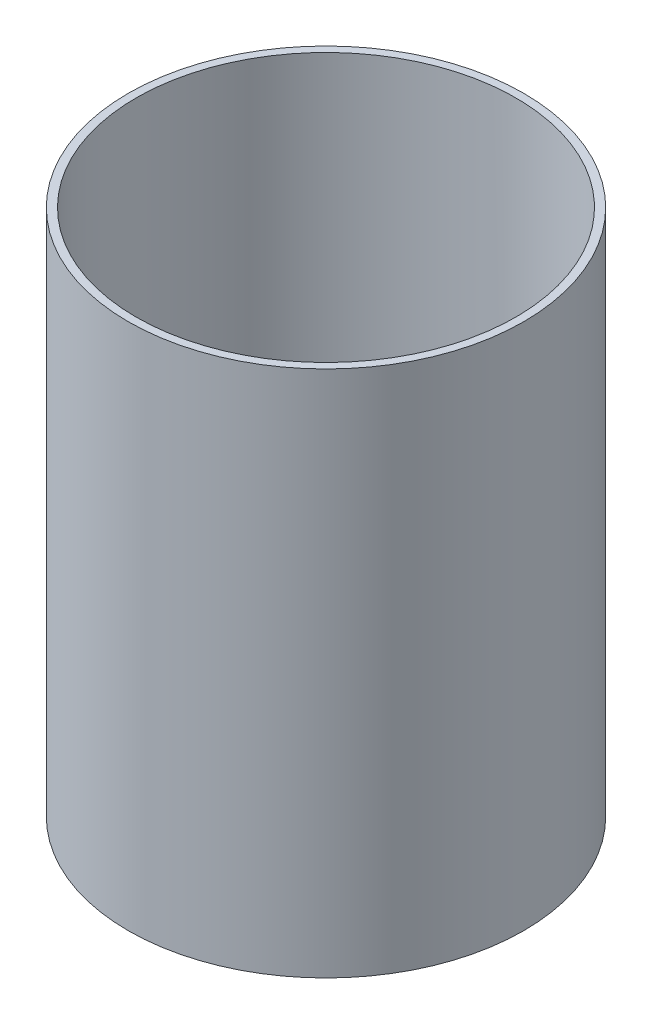
ISO-10303-21;
HEADER;
FILE_DESCRIPTION(('STEP AP214'),'2;1');
FILE_NAME('part.step','',(''),(''),'','','');
FILE_SCHEMA(('AUTOMOTIVE_DESIGN { 1 0 10303 214 1 1 1 1 }'));
ENDSEC;
DATA;
#1=APPLICATION_CONTEXT('core data for automotive mechanical design processes');
#2=APPLICATION_PROTOCOL_DEFINITION('international standard','automotive_design',2000,#1);
#3=PRODUCT_CONTEXT('',#1,'mechanical');
#4=PRODUCT('Part','Part','',(#3));
#5=PRODUCT_RELATED_PRODUCT_CATEGORY('part','',(#4));
#6=PRODUCT_DEFINITION_FORMATION('','',#4);
#7=PRODUCT_DEFINITION_CONTEXT('part definition',#1,'design');
#8=PRODUCT_DEFINITION('design','',#6,#7);
#9=PRODUCT_DEFINITION_SHAPE('','',#8);
#10=(LENGTH_UNIT() NAMED_UNIT(*) SI_UNIT(.MILLI.,.METRE.));
#11=(NAMED_UNIT(*) PLANE_ANGLE_UNIT() SI_UNIT($,.RADIAN.));
#12=(NAMED_UNIT(*) SI_UNIT($,.STERADIAN.) SOLID_ANGLE_UNIT());
#13=UNCERTAINTY_MEASURE_WITH_UNIT(LENGTH_MEASURE(1.E-05),#10,'distance_accuracy_value','');
#14=(GEOMETRIC_REPRESENTATION_CONTEXT(3) GLOBAL_UNCERTAINTY_ASSIGNED_CONTEXT((#13)) GLOBAL_UNIT_ASSIGNED_CONTEXT((#10,
#11,#12)) REPRESENTATION_CONTEXT('',''));
#15=CARTESIAN_POINT('',(0.,0.,0.));
#16=DIRECTION('',(0.,0.,1.));
#17=DIRECTION('',(1.,0.,0.));
#18=AXIS2_PLACEMENT_3D('',#15,#16,#17);
#19=CARTESIAN_POINT('',(0.,50.8,0.));
#20=DIRECTION('',(0.,1.,0.));
#21=DIRECTION('',(0.,0.,1.));
#22=AXIS2_PLACEMENT_3D('',#19,#20,#21);
#23=PLANE('',#22);
#24=CARTESIAN_POINT('',(0.,50.8,0.));
#25=DIRECTION('',(0.,1.,0.));
#26=DIRECTION('',(0.,0.,1.));
#27=AXIS2_PLACEMENT_3D('',#24,#25,#26);
#28=CIRCLE('',#27,38.1);
#29=CARTESIAN_POINT('',(0.,50.8,38.1));
#30=VERTEX_POINT('',#29);
#31=EDGE_CURVE('E10',#30,#30,#28,.T.);
#32=ORIENTED_EDGE('',*,*,#31,.T.);
#33=EDGE_LOOP('',(#32));
#34=FACE_BOUND('',#33,.T.);
#35=CARTESIAN_POINT('',(0.,50.8,0.));
#36=DIRECTION('',(0.,1.,0.));
#37=DIRECTION('',(0.,0.,1.));
#38=AXIS2_PLACEMENT_3D('',#35,#36,#37);
#39=CIRCLE('',#38,36.576);
#40=CARTESIAN_POINT('',(0.,50.8,36.576));
#41=VERTEX_POINT('',#40);
#42=EDGE_CURVE('E50',#41,#41,#39,.T.);
#43=ORIENTED_EDGE('',*,*,#42,.F.);
#44=EDGE_LOOP('',(#43));
#45=FACE_BOUND('',#44,.T.);
#46=ADVANCED_FACE('F31',(#34,#45),#23,.T.);
#47=CARTESIAN_POINT('',(0.,-50.8,0.));
#48=DIRECTION('',(0.,1.,0.));
#49=DIRECTION('',(0.,0.,1.));
#50=AXIS2_PLACEMENT_3D('',#47,#48,#49);
#51=PLANE('',#50);
#52=CARTESIAN_POINT('',(0.,-50.8,0.));
#53=DIRECTION('',(0.,1.,0.));
#54=DIRECTION('',(0.,0.,1.));
#55=AXIS2_PLACEMENT_3D('',#52,#53,#54);
#56=CIRCLE('',#55,38.1);
#57=CARTESIAN_POINT('',(0.,-50.8,38.1));
#58=VERTEX_POINT('',#57);
#59=EDGE_CURVE('E45',#58,#58,#56,.T.);
#60=ORIENTED_EDGE('',*,*,#59,.F.);
#61=EDGE_LOOP('',(#60));
#62=FACE_BOUND('',#61,.T.);
#63=CARTESIAN_POINT('',(0.,-50.8,0.));
#64=DIRECTION('',(0.,1.,0.));
#65=DIRECTION('',(0.,0.,1.));
#66=AXIS2_PLACEMENT_3D('',#63,#64,#65);
#67=CIRCLE('',#66,36.576);
#68=CARTESIAN_POINT('',(0.,-50.8,36.576));
#69=VERTEX_POINT('',#68);
#70=EDGE_CURVE('E53',#69,#69,#67,.T.);
#71=ORIENTED_EDGE('',*,*,#70,.T.);
#72=EDGE_LOOP('',(#71));
#73=FACE_BOUND('',#72,.T.);
#74=ADVANCED_FACE('F88',(#62,#73),#51,.F.);
#75=CARTESIAN_POINT('',(0.,50.8,0.));
#76=DIRECTION('',(0.,-1.,0.));
#77=DIRECTION('',(0.,0.,-1.));
#78=AXIS2_PLACEMENT_3D('',#75,#76,#77);
#79=CYLINDRICAL_SURFACE('',#78,38.1);
#80=CARTESIAN_POINT('',(0.,6.34999999999999,-38.1));
#81=CARTESIAN_POINT('',(-0.177087187489279,6.3500027287258,-38.1000011863187));
#82=CARTESIAN_POINT('',(-0.354137436244109,6.34258986032636,-38.0987630708564));
#83=CARTESIAN_POINT('',(-0.707020298099038,6.31299958695175,-38.0938477536353));
#84=CARTESIAN_POINT('',(-0.882852663182218,6.29081925907262,-38.0901700690163));
#85=CARTESIAN_POINT('',(-1.23209116083708,6.23184070761945,-38.0804739658059));
#86=CARTESIAN_POINT('',(-1.4054956913197,6.19503326277695,-38.0744540706817));
#87=CARTESIAN_POINT('',(-1.74860263812475,6.10706670963457,-38.0602401477359));
#88=CARTESIAN_POINT('',(-1.91830367136937,6.05590233531819,-38.0520453222257));
#89=CARTESIAN_POINT('',(-2.25254220668841,5.93968204827161,-38.0337223659018));
#90=CARTESIAN_POINT('',(-2.41708564982888,5.87464284723924,-38.0235965624201));
#91=CARTESIAN_POINT('',(-2.74014193111762,5.73108865416497,-38.0016821525234));
#92=CARTESIAN_POINT('',(-2.89865252044298,5.65256869595593,-37.98989293361));
#93=CARTESIAN_POINT('',(-3.20841653485805,5.48267748727417,-37.9649864854272));
#94=CARTESIAN_POINT('',(-3.35967352134211,5.39131263188385,-37.9518699179091));
#95=CARTESIAN_POINT('',(-3.65404496448426,5.19631000052296,-37.9246597405346));
#96=CARTESIAN_POINT('',(-3.79715636428495,5.09266766146105,-37.9105657682245));
#97=CARTESIAN_POINT('',(-4.07534808906753,4.87295704139125,-37.8816744348182));
#98=CARTESIAN_POINT('',(-4.21035302453209,4.75679392765043,-37.8668722576236));
#99=CARTESIAN_POINT('',(-4.4701701945329,4.51350901496519,-37.8370808534961));
#100=CARTESIAN_POINT('',(-4.59497863698451,4.38638317477704,-37.822091559342));
#101=CARTESIAN_POINT('',(-4.83345363594854,4.12212226847573,-37.7923559025335));
#102=CARTESIAN_POINT('',(-4.94712356668848,3.9849902556656,-37.7776094674422));
#103=CARTESIAN_POINT('',(-5.16261513533891,3.70156836191072,-37.7487646238876));
#104=CARTESIAN_POINT('',(-5.26443238791663,3.55527512202769,-37.7346664564344));
#105=CARTESIAN_POINT('',(-5.45600638335986,3.25370377286055,-37.7074450790141));
#106=CARTESIAN_POINT('',(-5.54568970289747,3.0983784466417,-37.6943280021243));
#107=CARTESIAN_POINT('',(-5.71167137591972,2.78055185995428,-37.6695348337581));
#108=CARTESIAN_POINT('',(-5.78796472928632,2.61804794707144,-37.6578592810601));
#109=CARTESIAN_POINT('',(-5.92652810623005,2.28711847501249,-37.6363015667466));
#110=CARTESIAN_POINT('',(-5.98880405333041,2.11869545207257,-37.6264186479379));
#111=CARTESIAN_POINT('',(-6.09891747906052,1.7770699666389,-37.6087259862464));
#112=CARTESIAN_POINT('',(-6.14674968619303,1.60386578428706,-37.600917000407));
#113=CARTESIAN_POINT('',(-6.26716384053575,1.08229212566174,-37.581106953425));
#114=CARTESIAN_POINT('',(-6.31810213845207,0.728511540990056,-37.5724910212383));
#115=CARTESIAN_POINT('',(-6.35996687648436,0.0175219888652963,-37.5654259452238));
#116=CARTESIAN_POINT('',(-6.35089756366378,-0.339686734173059,-37.5669760818881));
#117=CARTESIAN_POINT('',(-6.27352869541675,-1.04374248778809,-37.5799723761781));
#118=CARTESIAN_POINT('',(-6.20584069900666,-1.39065837404938,-37.5913163525528));
#119=CARTESIAN_POINT('',(-6.01409427766273,-2.06812597437277,-37.6224668880973));
#120=CARTESIAN_POINT('',(-5.89003391937083,-2.39867712675541,-37.6422737375101));
#121=CARTESIAN_POINT('',(-5.58844985400104,-3.0358801788231,-37.6882274534117));
#122=CARTESIAN_POINT('',(-5.41067212714135,-3.34240961460723,-37.7144043255227));
#123=CARTESIAN_POINT('',(-5.0068786187166,-3.92151745422893,-37.7701281067429));
#124=CARTESIAN_POINT('',(-4.78085894382577,-4.19409311504239,-37.7996752877603));
#125=CARTESIAN_POINT('',(-4.2836647932058,-4.70109818241926,-37.8592595138752));
#126=CARTESIAN_POINT('',(-4.01196546135645,-4.93501301685999,-37.8892980920187));
#127=CARTESIAN_POINT('',(-3.43289953929472,-5.35400953740192,-37.946142073942));
#128=CARTESIAN_POINT('',(-3.12553271928923,-5.5390909088611,-37.9729474568892));
#129=CARTESIAN_POINT('',(-2.48337302521498,-5.85521365152593,-38.0203428798906));
#130=CARTESIAN_POINT('',(-2.14855736243015,-5.98620956375732,-38.0409276876551));
#131=CARTESIAN_POINT('',(-1.46125779833499,-6.18996530806874,-38.0735205764156));
#132=CARTESIAN_POINT('',(-1.10877537768379,-6.26273001188952,-38.0855293748888));
#133=CARTESIAN_POINT('',(-0.40058314914016,-6.34726025051472,-38.0995206980173));
#134=CARTESIAN_POINT('',(-0.0449598721958756,-6.35973219379204,-38.1016193264734));
#135=CARTESIAN_POINT('',(0.66329502297262,-6.32520618374683,-38.0958718503491));
#136=CARTESIAN_POINT('',(1.01592675578098,-6.27821051864089,-38.0880261284112));
#137=CARTESIAN_POINT('',(1.70600668639052,-6.12667088825344,-38.063343404013));
#138=CARTESIAN_POINT('',(2.04353380753409,-6.02247665149521,-38.0465610611375));
#139=CARTESIAN_POINT('',(2.69632908571019,-5.75987030296589,-38.0058793979819));
#140=CARTESIAN_POINT('',(3.01159599157095,-5.60145514654107,-37.9819796780514));
#141=CARTESIAN_POINT('',(3.61398995815132,-5.23328622162175,-37.9294267110082));
#142=CARTESIAN_POINT('',(3.90084376323506,-5.0230911969495,-37.9007333280144));
#143=CARTESIAN_POINT('',(4.43545868132023,-4.55793492528629,-37.8418970832711));
#144=CARTESIAN_POINT('',(4.68321695230037,-4.30297042665492,-37.8117541163526));
#145=CARTESIAN_POINT('',(5.13522675786021,-3.75234933547671,-37.7530404075497));
#146=CARTESIAN_POINT('',(5.33900101896994,-3.45629857310199,-37.7244891869762));
#147=CARTESIAN_POINT('',(5.69392350241975,-2.83373930501121,-37.6725570192594));
#148=CARTESIAN_POINT('',(5.8450733929432,-2.50723176518577,-37.6491759082333));
#149=CARTESIAN_POINT('',(6.08974872162487,-1.8344295197639,-37.6103751182998));
#150=CARTESIAN_POINT('',(6.18351170337908,-1.48822295551794,-37.5949226636084));
#151=CARTESIAN_POINT('',(6.31147698831455,-0.78449735994558,-37.5736562611202));
#152=CARTESIAN_POINT('',(6.34568446957212,-0.426979314852599,-37.5678414753746));
#153=CARTESIAN_POINT('',(6.35156479805326,0.107200424943623,-37.566839453881));
#154=CARTESIAN_POINT('',(6.3461134925206,0.283891890974141,-37.5677648877224));
#155=CARTESIAN_POINT('',(6.32051614738165,0.63615898229896,-37.5720813559984));
#156=CARTESIAN_POINT('',(6.30037562911679,0.811735001858512,-37.5754714640165));
#157=CARTESIAN_POINT('',(6.24553793473015,1.16058669238111,-37.5846246847688));
#158=CARTESIAN_POINT('',(6.21083556002646,1.3338615190051,-37.5903886449545));
#159=CARTESIAN_POINT('',(6.12715693228831,1.67677649769051,-37.604118742639));
#160=CARTESIAN_POINT('',(6.0781858174276,1.84641793457066,-37.6120840873662));
#161=CARTESIAN_POINT('',(5.96637654372831,2.18080412850474,-37.6299820560965));
#162=CARTESIAN_POINT('',(5.90354973294344,2.34555276827213,-37.6399130695049));
#163=CARTESIAN_POINT('',(5.76449173077207,2.66910658257644,-37.6614601477677));
#164=CARTESIAN_POINT('',(5.68826534098594,2.82791386149802,-37.6730756087577));
#165=CARTESIAN_POINT('',(5.5229061312423,3.13862904251532,-37.6976722605729));
#166=CARTESIAN_POINT('',(5.43376825184751,3.29053420918424,-37.7106539862286));
#167=CARTESIAN_POINT('',(5.24326758944334,3.58630413755221,-37.7376124328875));
#168=CARTESIAN_POINT('',(5.14190910346796,3.73017169956176,-37.7515888034474));
#169=CARTESIAN_POINT('',(4.92632600417356,4.01067104735172,-37.7803292409247));
#170=CARTESIAN_POINT('',(4.81195911510494,4.14719273443224,-37.7951008544654));
#171=CARTESIAN_POINT('',(4.57222320121723,4.4100920135284,-37.824851025054));
#172=CARTESIAN_POINT('',(4.44685811987933,4.53647321062228,-37.8398295063179));
#173=CARTESIAN_POINT('',(4.18587205978364,4.77835205107128,-37.869588465624));
#174=CARTESIAN_POINT('',(4.05024500803611,4.89384315746955,-37.8843688202287));
#175=CARTESIAN_POINT('',(3.76978048024299,5.11301455945323,-37.9133039762987));
#176=CARTESIAN_POINT('',(3.6249464222659,5.21669919870492,-37.9274590066437));
#177=CARTESIAN_POINT('',(3.32592456844756,5.41228918862145,-37.9548537782111));
#178=CARTESIAN_POINT('',(3.17167621479995,5.504103036644,-37.9680860844735));
#179=CARTESIAN_POINT('',(2.85593164400635,5.67435586892612,-37.9931404953123));
#180=CARTESIAN_POINT('',(2.69443812110206,5.75279977379904,-38.0049631182187));
#181=CARTESIAN_POINT('',(2.36539813222964,5.89572189696044,-38.026859543709));
#182=CARTESIAN_POINT('',(2.19785596261659,5.96020980901387,-38.0369345592008));
#183=CARTESIAN_POINT('',(1.85787010097684,6.07478441999711,-38.05505638655));
#184=CARTESIAN_POINT('',(1.68542746934926,6.12487420881731,-38.0631036335282));
#185=CARTESIAN_POINT('',(1.26427501955243,6.22805244248603,-38.0798175597504));
#186=CARTESIAN_POINT('',(1.01366559672307,6.27372844443033,-38.0873506266376));
#187=CARTESIAN_POINT('',(0.508678681414368,6.33470000240438,-38.0974409521383));
#188=CARTESIAN_POINT('',(0.254301253884984,6.34999608148727,-38.0999982964193));
#189=CARTESIAN_POINT('',(0.,6.34999999999999,-38.1));
#190=B_SPLINE_CURVE_WITH_KNOTS('',3,(#80,#81,#82,#83,#84,#85,#86,#87,#88,#89,#90,#91,#92,#93,
#94,#95,#96,#97,#98,#99,#100,#101,#102,#103,#104,#105,#106,#107,#108,#109,#110,#111,#112,#113,
#114,#115,#116,#117,#118,#119,#120,#121,#122,#123,#124,#125,#126,#127,#128,#129,#130,#131,#132,
#133,#134,#135,#136,#137,#138,#139,#140,#141,#142,#143,#144,#145,#146,#147,#148,#149,#150,#151,
#152,#153,#154,#155,#156,#157,#158,#159,#160,#161,#162,#163,#164,#165,#166,#167,#168,#169,#170,
#171,#172,#173,#174,#175,#176,#177,#178,#179,#180,#181,#182,#183,#184,#185,#186,#187,#188,#189),
.UNSPECIFIED.,.T.,.F.,(4,2,2,2,2,2,2,2,2,2,2,2,2,2,2,2,2,2,2,2,2,2,2,2,2,2,2,2,2,2,2,2,2,2,2,2,
2,2,2,2,2,2,2,2,2,2,2,2,2,2,2,2,2,2,4),(0.,0.531038660598126,1.06218246024441,1.59366163761646,
2.12533601304965,2.65637358661449,3.1876072101753,3.71857727922958,4.24974531326047,
4.78526441519897,5.3209817790362,5.85653635119168,6.39228844582579,6.93114981384536,
7.47021197879168,8.00904591554079,8.54807627219621,9.61504645798446,10.6819411293247,
11.7378373522885,12.7937697912188,13.8547758380411,14.9158675448607,15.9901084553218,
17.0643562871247,18.1395051980381,19.2145641504113,20.2769963402556,21.339387650685,
22.3953543975371,23.4513804495562,24.5167374705005,25.5821719011529,26.6586431785677,
27.7350803289231,28.807031067069,29.8788885993829,30.4087059677912,30.9383242924513,
31.4681318518971,31.9977488629147,32.5269337088015,33.0559293119034,33.5851327684115,
34.1141506850706,34.6496427436838,35.1849435764207,35.720563713634,36.2559861520879,
36.795316710381,37.3344483452647,37.8732042913802,38.4118445320141,39.1744413312763,
39.9370250007452),.UNSPECIFIED.);
#191=CARTESIAN_POINT('',(0.,6.34999999999999,-38.1));
#192=VERTEX_POINT('',#191);
#193=EDGE_CURVE('E62',#192,#192,#190,.T.);
#194=ORIENTED_EDGE('',*,*,#193,.T.);
#195=EDGE_LOOP('',(#194));
#196=FACE_BOUND('',#195,.T.);
#197=CARTESIAN_POINT('',(-38.1,-6.35,0.));
#198=CARTESIAN_POINT('',(-38.1000011863187,-6.35000272872581,-0.177087187489278));
#199=CARTESIAN_POINT('',(-38.0987630708564,-6.34258986032636,-0.354137436244109));
#200=CARTESIAN_POINT('',(-38.0938477536353,-6.31299958695175,-0.707020298099037));
#201=CARTESIAN_POINT('',(-38.0901700690163,-6.29081925907261,-0.882852663182217));
#202=CARTESIAN_POINT('',(-38.0804739658059,-6.23184070761945,-1.23209116083708));
#203=CARTESIAN_POINT('',(-38.0744540706817,-6.19503326277695,-1.4054956913197));
#204=CARTESIAN_POINT('',(-38.0602401477359,-6.10706670963457,-1.74860263812475));
#205=CARTESIAN_POINT('',(-38.0520453222257,-6.05590233531819,-1.91830367136937));
#206=CARTESIAN_POINT('',(-38.0337223659018,-5.93968204827161,-2.25254220668841));
#207=CARTESIAN_POINT('',(-38.0235965624201,-5.87464284723924,-2.41708564982888));
#208=CARTESIAN_POINT('',(-38.0016821525234,-5.73108865416497,-2.74014193111762));
#209=CARTESIAN_POINT('',(-37.98989293361,-5.65256869595593,-2.89865252044299));
#210=CARTESIAN_POINT('',(-37.9649864854272,-5.48267748727417,-3.20841653485805));
#211=CARTESIAN_POINT('',(-37.9518699179091,-5.39131263188385,-3.35967352134212));
#212=CARTESIAN_POINT('',(-37.9246597405346,-5.19631000052296,-3.65404496448426));
#213=CARTESIAN_POINT('',(-37.9105657682245,-5.09266766146105,-3.79715636428495));
#214=CARTESIAN_POINT('',(-37.8816744348182,-4.87295704139125,-4.07534808906753));
#215=CARTESIAN_POINT('',(-37.8668722576236,-4.75679392765043,-4.21035302453209));
#216=CARTESIAN_POINT('',(-37.8370808534961,-4.51350901496519,-4.4701701945329));
#217=CARTESIAN_POINT('',(-37.822091559342,-4.38638317477704,-4.59497863698451));
#218=CARTESIAN_POINT('',(-37.7923559025335,-4.12212226847573,-4.83345363594854));
#219=CARTESIAN_POINT('',(-37.7776094674422,-3.9849902556656,-4.94712356668849));
#220=CARTESIAN_POINT('',(-37.7487646238876,-3.70156836191072,-5.16261513533891));
#221=CARTESIAN_POINT('',(-37.7346664564344,-3.55527512202769,-5.26443238791663));
#222=CARTESIAN_POINT('',(-37.7074450790141,-3.25370377286055,-5.45600638335987));
#223=CARTESIAN_POINT('',(-37.6943280021243,-3.0983784466417,-5.54568970289747));
#224=CARTESIAN_POINT('',(-37.6695348337581,-2.78055185995428,-5.71167137591972));
#225=CARTESIAN_POINT('',(-37.6578592810601,-2.61804794707144,-5.78796472928632));
#226=CARTESIAN_POINT('',(-37.6363015667466,-2.28711847501249,-5.92652810623005));
#227=CARTESIAN_POINT('',(-37.6264186479379,-2.11869545207257,-5.98880405333041));
#228=CARTESIAN_POINT('',(-37.6087259862464,-1.7770699666389,-6.09891747906052));
#229=CARTESIAN_POINT('',(-37.600917000407,-1.60386578428706,-6.14674968619303));
#230=CARTESIAN_POINT('',(-37.581106953425,-1.08229212566174,-6.26716384053575));
#231=CARTESIAN_POINT('',(-37.5724910212383,-0.728511540990054,-6.31810213845207));
#232=CARTESIAN_POINT('',(-37.5654259452238,-0.0175219888652941,-6.35996687648436));
#233=CARTESIAN_POINT('',(-37.5669760818881,0.339686734173061,-6.35089756366378));
#234=CARTESIAN_POINT('',(-37.5799723761781,1.04374248778809,-6.27352869541675));
#235=CARTESIAN_POINT('',(-37.5913163525528,1.39065837404938,-6.20584069900666));
#236=CARTESIAN_POINT('',(-37.6224668880973,2.06812597437278,-6.01409427766273));
#237=CARTESIAN_POINT('',(-37.6422737375101,2.39867712675541,-5.89003391937083));
#238=CARTESIAN_POINT('',(-37.6882274534117,3.0358801788231,-5.58844985400104));
#239=CARTESIAN_POINT('',(-37.7144043255227,3.34240961460723,-5.41067212714135));
#240=CARTESIAN_POINT('',(-37.7701281067429,3.92151745422894,-5.0068786187166));
#241=CARTESIAN_POINT('',(-37.7996752877603,4.19409311504239,-4.78085894382577));
#242=CARTESIAN_POINT('',(-37.8592595138752,4.70109818241926,-4.2836647932058));
#243=CARTESIAN_POINT('',(-37.8892980920187,4.93501301685999,-4.01196546135645));
#244=CARTESIAN_POINT('',(-37.946142073942,5.35400953740192,-3.43289953929472));
#245=CARTESIAN_POINT('',(-37.9729474568892,5.5390909088611,-3.12553271928923));
#246=CARTESIAN_POINT('',(-38.0203428798906,5.85521365152593,-2.48337302521497));
#247=CARTESIAN_POINT('',(-38.0409276876551,5.98620956375732,-2.14855736243015));
#248=CARTESIAN_POINT('',(-38.0735205764156,6.18996530806874,-1.46125779833498));
#249=CARTESIAN_POINT('',(-38.0855293748888,6.26273001188952,-1.10877537768379));
#250=CARTESIAN_POINT('',(-38.0995206980173,6.34726025051472,-0.400583149140154));
#251=CARTESIAN_POINT('',(-38.1016193264734,6.35973219379204,-0.0449598721958704));
#252=CARTESIAN_POINT('',(-38.0958718503491,6.32520618374682,0.663295022972625));
#253=CARTESIAN_POINT('',(-38.0880261284112,6.27821051864089,1.01592675578099));
#254=CARTESIAN_POINT('',(-38.063343404013,6.12667088825344,1.70600668639052));
#255=CARTESIAN_POINT('',(-38.0465610611375,6.02247665149521,2.04353380753409));
#256=CARTESIAN_POINT('',(-38.0058793979819,5.75987030296589,2.69632908571019));
#257=CARTESIAN_POINT('',(-37.9819796780514,5.60145514654107,3.01159599157095));
#258=CARTESIAN_POINT('',(-37.9294267110082,5.23328622162174,3.61398995815133));
#259=CARTESIAN_POINT('',(-37.9007333280144,5.0230911969495,3.90084376323507));
#260=CARTESIAN_POINT('',(-37.8418970832711,4.55793492528629,4.43545868132024));
#261=CARTESIAN_POINT('',(-37.8117541163526,4.30297042665492,4.68321695230038));
#262=CARTESIAN_POINT('',(-37.7530404075497,3.7523493354767,5.13522675786021));
#263=CARTESIAN_POINT('',(-37.7244891869762,3.45629857310198,5.33900101896994));
#264=CARTESIAN_POINT('',(-37.6725570192594,2.8337393050112,5.69392350241975));
#265=CARTESIAN_POINT('',(-37.6491759082333,2.50723176518576,5.8450733929432));
#266=CARTESIAN_POINT('',(-37.6103751182998,1.8344295197639,6.08974872162488));
#267=CARTESIAN_POINT('',(-37.5949226636084,1.48822295551793,6.18351170337909));
#268=CARTESIAN_POINT('',(-37.5736562611202,0.784497359945574,6.31147698831455));
#269=CARTESIAN_POINT('',(-37.5678414753746,0.426979314852593,6.34568446957212));
#270=CARTESIAN_POINT('',(-37.566839453881,-0.107200424943629,6.35156479805326));
#271=CARTESIAN_POINT('',(-37.5677648877224,-0.283891890974147,6.3461134925206));
#272=CARTESIAN_POINT('',(-37.5720813559984,-0.636158982298966,6.32051614738165));
#273=CARTESIAN_POINT('',(-37.5754714640165,-0.811735001858518,6.30037562911679));
#274=CARTESIAN_POINT('',(-37.5846246847688,-1.16058669238111,6.24553793473014));
#275=CARTESIAN_POINT('',(-37.5903886449545,-1.33386151900511,6.21083556002646));
#276=CARTESIAN_POINT('',(-37.604118742639,-1.67677649769052,6.1271569322883));
#277=CARTESIAN_POINT('',(-37.6120840873662,-1.84641793457067,6.0781858174276));
#278=CARTESIAN_POINT('',(-37.6299820560965,-2.18080412850474,5.96637654372831));
#279=CARTESIAN_POINT('',(-37.6399130695049,-2.34555276827214,5.90354973294343));
#280=CARTESIAN_POINT('',(-37.6614601477677,-2.66910658257645,5.76449173077207));
#281=CARTESIAN_POINT('',(-37.6730756087577,-2.82791386149803,5.68826534098594));
#282=CARTESIAN_POINT('',(-37.6976722605729,-3.13862904251533,5.52290613124229));
#283=CARTESIAN_POINT('',(-37.7106539862286,-3.29053420918425,5.43376825184751));
#284=CARTESIAN_POINT('',(-37.7376124328875,-3.58630413755222,5.24326758944333));
#285=CARTESIAN_POINT('',(-37.7515888034474,-3.73017169956177,5.14190910346795));
#286=CARTESIAN_POINT('',(-37.7803292409247,-4.01067104735172,4.92632600417355));
#287=CARTESIAN_POINT('',(-37.7951008544654,-4.14719273443224,4.81195911510494));
#288=CARTESIAN_POINT('',(-37.824851025054,-4.4100920135284,4.57222320121723));
#289=CARTESIAN_POINT('',(-37.8398295063179,-4.53647321062228,4.44685811987933));
#290=CARTESIAN_POINT('',(-37.869588465624,-4.77835205107128,4.18587205978364));
#291=CARTESIAN_POINT('',(-37.8843688202287,-4.89384315746955,4.05024500803611));
#292=CARTESIAN_POINT('',(-37.9133039762987,-5.11301455945323,3.76978048024299));
#293=CARTESIAN_POINT('',(-37.9274590066437,-5.21669919870493,3.62494642226589));
#294=CARTESIAN_POINT('',(-37.9548537782111,-5.41228918862146,3.32592456844756));
#295=CARTESIAN_POINT('',(-37.9680860844735,-5.504103036644,3.17167621479994));
#296=CARTESIAN_POINT('',(-37.9931404953123,-5.67435586892612,2.85593164400635));
#297=CARTESIAN_POINT('',(-38.0049631182187,-5.75279977379904,2.69443812110206));
#298=CARTESIAN_POINT('',(-38.026859543709,-5.89572189696044,2.36539813222963));
#299=CARTESIAN_POINT('',(-38.0369345592008,-5.96020980901387,2.19785596261659));
#300=CARTESIAN_POINT('',(-38.05505638655,-6.07478441999711,1.85787010097683));
#301=CARTESIAN_POINT('',(-38.0631036335282,-6.12487420881731,1.68542746934925));
#302=CARTESIAN_POINT('',(-38.0798175597504,-6.22805244248603,1.26427501955242));
#303=CARTESIAN_POINT('',(-38.0873506266376,-6.27372844443033,1.01366559672306));
#304=CARTESIAN_POINT('',(-38.0974409521383,-6.33470000240439,0.508678681414362));
#305=CARTESIAN_POINT('',(-38.0999982964193,-6.34999608148729,0.254301253884981));
#306=CARTESIAN_POINT('',(-38.1,-6.35,0.));
#307=B_SPLINE_CURVE_WITH_KNOTS('',3,(#197,#198,#199,#200,#201,#202,#203,#204,#205,#206,#207,
#208,#209,#210,#211,#212,#213,#214,#215,#216,#217,#218,#219,#220,#221,#222,#223,#224,#225,#226,
#227,#228,#229,#230,#231,#232,#233,#234,#235,#236,#237,#238,#239,#240,#241,#242,#243,#244,#245,
#246,#247,#248,#249,#250,#251,#252,#253,#254,#255,#256,#257,#258,#259,#260,#261,#262,#263,#264,
#265,#266,#267,#268,#269,#270,#271,#272,#273,#274,#275,#276,#277,#278,#279,#280,#281,#282,#283,
#284,#285,#286,#287,#288,#289,#290,#291,#292,#293,#294,#295,#296,#297,#298,#299,#300,#301,#302,
#303,#304,#305,#306),.UNSPECIFIED.,.T.,.F.,(4,2,2,2,2,2,2,2,2,2,2,2,2,2,2,2,2,2,2,2,2,2,2,2,2,2,
2,2,2,2,2,2,2,2,2,2,2,2,2,2,2,2,2,2,2,2,2,2,2,2,2,2,2,2,4),(0.,0.531038660598125,
1.06218246024441,1.59366163761647,2.12533601304965,2.6563735866145,3.1876072101753,
3.71857727922958,4.24974531326047,4.78526441519897,5.3209817790362,5.85653635119168,
6.39228844582579,6.93114981384536,7.47021197879168,8.00904591554079,8.54807627219621,
9.61504645798446,10.6819411293247,11.7378373522885,12.7937697912188,13.8547758380411,
14.9158675448607,15.9901084553218,17.0643562871247,18.1395051980381,19.2145641504113,
20.2769963402556,21.339387650685,22.3953543975371,23.4513804495562,24.5167374705005,
25.5821719011529,26.6586431785677,27.7350803289231,28.807031067069,29.8788885993829,
30.4087059677912,30.9383242924513,31.4681318518971,31.9977488629147,32.5269337088015,
33.0559293119034,33.5851327684116,34.1141506850706,34.6496427436838,35.1849435764207,
35.720563713634,36.2559861520879,36.795316710381,37.3344483452647,37.8732042913802,
38.4118445320141,39.1744413312763,39.9370250007452),.UNSPECIFIED.);
#308=CARTESIAN_POINT('',(-38.1,-6.35,0.));
#309=VERTEX_POINT('',#308);
#310=EDGE_CURVE('E61',#309,#309,#307,.T.);
#311=ORIENTED_EDGE('',*,*,#310,.T.);
#312=EDGE_LOOP('',(#311));
#313=FACE_BOUND('',#312,.T.);
#314=ORIENTED_EDGE('',*,*,#31,.F.);
#315=EDGE_LOOP('',(#314));
#316=FACE_BOUND('',#315,.T.);
#317=ORIENTED_EDGE('',*,*,#59,.T.);
#318=EDGE_LOOP('',(#317));
#319=FACE_BOUND('',#318,.T.);
#320=ADVANCED_FACE('F33',(#196,#313,#316,#319),#79,.T.);
#321=CARTESIAN_POINT('',(0.,50.8,0.));
#322=DIRECTION('',(0.,-1.,0.));
#323=DIRECTION('',(0.,0.,-1.));
#324=AXIS2_PLACEMENT_3D('',#321,#322,#323);
#325=CYLINDRICAL_SURFACE('',#324,36.576);
#326=CARTESIAN_POINT('',(0.,6.34999999999999,-36.576));
#327=CARTESIAN_POINT('',(-0.176976325530285,6.35000287356267,-36.5760012945108));
#328=CARTESIAN_POINT('',(-0.353914342468719,6.34259920709208,-36.5747131746761));
#329=CARTESIAN_POINT('',(-0.706571977969743,6.31304651958685,-36.5695994733589));
#330=CARTESIAN_POINT('',(-0.882291355603535,6.29089466228874,-36.5657734037972));
#331=CARTESIAN_POINT('',(-1.23129928364502,6.23199376766404,-36.55568609112));
#332=CARTESIAN_POINT('',(-1.40458628774961,6.19523584469293,-36.5494233657059));
#333=CARTESIAN_POINT('',(-1.74745881724025,6.10739036514848,-36.5346358788364));
#334=CARTESIAN_POINT('',(-1.9170429593343,6.05629754891174,-36.5261102871673));
#335=CARTESIAN_POINT('',(-2.25104572090535,5.94024515296208,-36.5070475302611));
#336=CARTESIAN_POINT('',(-2.41547041941531,5.87530265364371,-36.4965128444558));
#337=CARTESIAN_POINT('',(-2.73829536591693,5.73196654433359,-36.4737126056306));
#338=CARTESIAN_POINT('',(-2.89669336710271,5.65356797668145,-36.461446414964));
#339=CARTESIAN_POINT('',(-3.20624420049946,5.48394310313294,-36.4355305940484));
#340=CARTESIAN_POINT('',(-3.35740051902004,5.3927230547123,-36.4218816395542));
#341=CARTESIAN_POINT('',(-3.65158573004244,5.19803290344099,-36.3935646322881));
#342=CARTESIAN_POINT('',(-3.79461156885834,5.09455824234703,-36.3788962011537));
#343=CARTESIAN_POINT('',(-4.07274853150926,4.87512818720327,-36.3488134468891));
#344=CARTESIAN_POINT('',(-4.20777798978666,4.7590700171463,-36.3333936520508));
#345=CARTESIAN_POINT('',(-4.46765481887682,4.51599686061694,-36.3023549128926));
#346=CARTESIAN_POINT('',(-4.59249840081843,4.38897783282501,-36.2867358969432));
#347=CARTESIAN_POINT('',(-4.83105706212909,4.12492858196803,-36.2557461843979));
#348=CARTESIAN_POINT('',(-4.9447754807151,3.9879013845553,-36.2403754144545));
#349=CARTESIAN_POINT('',(-5.16037844196104,3.70468362984224,-36.2103041420945));
#350=CARTESIAN_POINT('',(-5.26225860467095,3.55848971161876,-36.1956038889718));
#351=CARTESIAN_POINT('',(-5.45402698796031,3.25702379424687,-36.1672065010589));
#352=CARTESIAN_POINT('',(-5.54383477831035,3.10169995000863,-36.1535163443449));
#353=CARTESIAN_POINT('',(-5.71006391280871,2.78385561074583,-36.1276351977729));
#354=CARTESIAN_POINT('',(-5.78648025219421,2.6213324534419,-36.1154447689104));
#355=CARTESIAN_POINT('',(-5.92528461329316,2.29034381415566,-36.0929319467229));
#356=CARTESIAN_POINT('',(-5.9876786268578,2.12188090601322,-36.0826087558818));
#357=CARTESIAN_POINT('',(-6.09802010313298,1.78015526119864,-36.064123603798));
#358=CARTESIAN_POINT('',(-6.14596229768499,1.60689079927482,-36.0559624308123));
#359=CARTESIAN_POINT('',(-6.26662497306746,1.08537679683724,-36.0352628519657));
#360=CARTESIAN_POINT('',(-6.31772964193668,0.731699985876126,-36.0262483739827));
#361=CARTESIAN_POINT('',(-6.35995246913132,0.0208797533859168,-36.0188172467626));
#362=CARTESIAN_POINT('',(-6.3510752340541,-0.336263399825243,-36.0203997836768));
#363=CARTESIAN_POINT('',(-6.27414689154493,-1.0398847107164,-36.0338774755505));
#364=CARTESIAN_POINT('',(-6.20676083065249,-1.38643756938357,-36.0456567240348));
#365=CARTESIAN_POINT('',(-6.01575115113305,-2.06322920558555,-36.0780238882504));
#366=CARTESIAN_POINT('',(-5.89212545469308,-2.39346737986305,-36.0986121294344));
#367=CARTESIAN_POINT('',(-5.59148471736323,-3.03024912581109,-36.1464001608672));
#368=CARTESIAN_POINT('',(-5.41419589626239,-3.33666081701149,-36.1736337128838));
#369=CARTESIAN_POINT('',(-5.01145410215597,-3.9156368957823,-36.2316211113757));
#370=CARTESIAN_POINT('',(-4.78599691938735,-4.18819832165169,-36.2623752654314));
#371=CARTESIAN_POINT('',(-4.28970629842905,-4.69558652844159,-36.3244466955193));
#372=CARTESIAN_POINT('',(-4.01830265068729,-4.92985568626242,-36.355765977428));
#373=CARTESIAN_POINT('',(-3.43974503392218,-5.349615347508,-36.415056669943));
#374=CARTESIAN_POINT('',(-3.13259079673204,-5.53510548500508,-36.4430280554335));
#375=CARTESIAN_POINT('',(-2.49070833297929,-5.85210255672358,-36.4925161651277));
#376=CARTESIAN_POINT('',(-2.15595388717609,-5.98355743312285,-36.5140266595326));
#377=CARTESIAN_POINT('',(-1.46866058810239,-6.18822016550837,-36.5481199962223));
#378=CARTESIAN_POINT('',(-1.1161233539535,-6.26143331425659,-36.5607036497293));
#379=CARTESIAN_POINT('',(-0.408075103543759,-6.34677193830029,-36.5754156337356));
#380=CARTESIAN_POINT('',(-0.0526589208909383,-6.35966244005239,-36.5776748920378));
#381=CARTESIAN_POINT('',(0.655253112947846,-6.32603345100808,-36.5718431121189));
#382=CARTESIAN_POINT('',(1.00774908579019,-6.27951644779192,-36.5637525072793));
#383=CARTESIAN_POINT('',(1.69743121821302,-6.1290291859526,-36.5382112664358));
#384=CARTESIAN_POINT('',(2.03470310755376,-6.02544036153527,-36.5208227943509));
#385=CARTESIAN_POINT('',(2.68709311468514,-5.76415846276761,-36.4786275081731));
#386=CARTESIAN_POINT('',(3.00220990066129,-5.60646213918646,-36.4538202485831));
#387=CARTESIAN_POINT('',(3.60464919025515,-5.23970880588003,-36.3992135067456));
#388=CARTESIAN_POINT('',(3.89167861659085,-5.03017725391605,-36.3693687579914));
#389=CARTESIAN_POINT('',(4.42677539603422,-4.566349349097,-36.3081272562954));
#390=CARTESIAN_POINT('',(4.6748396593388,-4.31204944965377,-36.2767303805346));
#391=CARTESIAN_POINT('',(5.12782366788073,-3.76246648128097,-36.2154961358914));
#392=CARTESIAN_POINT('',(5.33222481107721,-3.46675321240607,-36.1856803702851));
#393=CARTESIAN_POINT('',(5.68844912963807,-2.84472410241155,-36.1313981797288));
#394=CARTESIAN_POINT('',(5.84027407113994,-2.51840928972572,-36.1069315751002));
#395=CARTESIAN_POINT('',(6.08627929416814,-1.84591502100793,-36.0662797185257));
#396=CARTESIAN_POINT('',(6.18071111747444,-1.49982962798298,-36.0500583813144));
#397=CARTESIAN_POINT('',(6.31001470542069,-0.796203572824201,-36.0276557360365));
#398=CARTESIAN_POINT('',(6.34489213498188,-0.438664003528704,-36.0214734730378));
#399=CARTESIAN_POINT('',(6.35174825857336,0.0954378868001844,-36.0202564273902));
#400=CARTESIAN_POINT('',(6.34663063413231,0.271987112432718,-36.0211626968524));
#401=CARTESIAN_POINT('',(6.32172408601681,0.623997669012738,-36.0255436307018));
#402=CARTESIAN_POINT('',(6.30194068496488,0.799459384406128,-36.0290173282831));
#403=CARTESIAN_POINT('',(6.24783908629043,1.14811030884251,-36.0384381002847));
#404=CARTESIAN_POINT('',(6.21351571749139,1.32129868675212,-36.0443860546671));
#405=CARTESIAN_POINT('',(6.13061546982124,1.66406983963997,-36.058578719562));
#406=CARTESIAN_POINT('',(6.0820437122959,1.83365388668751,-36.0668226047868));
#407=CARTESIAN_POINT('',(5.97106382205363,2.167920652599,-36.08536171958));
#408=CARTESIAN_POINT('',(5.90866994216078,2.33260822352938,-36.0956548349638));
#409=CARTESIAN_POINT('',(5.77050087454726,2.65607587532311,-36.1180008891446));
#410=CARTESIAN_POINT('',(5.69473046832491,2.81485804262698,-36.130053198844));
#411=CARTESIAN_POINT('',(5.53030360830654,3.12556365820673,-36.1555865516386));
#412=CARTESIAN_POINT('',(5.44164204292702,3.27748435431702,-36.1690681609007));
#413=CARTESIAN_POINT('',(5.25211040639765,3.57333009039244,-36.1970755981707));
#414=CARTESIAN_POINT('',(5.15124460691841,3.71725790240372,-36.2116010600955));
#415=CARTESIAN_POINT('',(4.93655785765073,3.9980675490135,-36.2414965089827));
#416=CARTESIAN_POINT('',(4.82258309073298,4.13483089373111,-36.256875129947));
#417=CARTESIAN_POINT('',(4.58361535006715,4.39824773569023,-36.2878595852548));
#418=CARTESIAN_POINT('',(4.4586263132912,4.5249048147459,-36.3034653367603));
#419=CARTESIAN_POINT('',(4.19837166912275,4.7673707915388,-36.3344826652115));
#420=CARTESIAN_POINT('',(4.06309998716474,4.88317318514709,-36.3498941210091));
#421=CARTESIAN_POINT('',(3.78331931965952,5.10300246249432,-36.3800777480092));
#422=CARTESIAN_POINT('',(3.63881376065328,5.20703367507427,-36.3948501529796));
#423=CARTESIAN_POINT('',(3.34032090386829,5.40341783815655,-36.4234633722114));
#424=CARTESIAN_POINT('',(3.18626731890887,5.49567129632595,-36.4372958401015));
#425=CARTESIAN_POINT('',(2.87086491355851,5.66681718615062,-36.4635015020636));
#426=CARTESIAN_POINT('',(2.70951880591181,5.74571453515163,-36.4758752326902));
#427=CARTESIAN_POINT('',(2.38072093435576,5.88955337799969,-36.49880916944));
#428=CARTESIAN_POINT('',(2.21327339487008,5.95450432090355,-36.509370602462));
#429=CARTESIAN_POINT('',(1.87342645104492,6.07000749307179,-36.5283866766343));
#430=CARTESIAN_POINT('',(1.70102809680004,6.12056275126703,-36.5368417609249));
#431=CARTESIAN_POINT('',(1.27746210042433,6.22547003973459,-36.5545342688997));
#432=CARTESIAN_POINT('',(1.02429180957923,6.27211176082007,-36.5625455295631));
#433=CARTESIAN_POINT('',(0.514054035769131,6.33437434991942,-36.5732774032712));
#434=CARTESIAN_POINT('',(0.256986629461026,6.34999582731086,-36.575998120246));
#435=CARTESIAN_POINT('',(0.,6.34999999999999,-36.576));
#436=B_SPLINE_CURVE_WITH_KNOTS('',3,(#326,#327,#328,#329,#330,#331,#332,#333,#334,#335,#336,
#337,#338,#339,#340,#341,#342,#343,#344,#345,#346,#347,#348,#349,#350,#351,#352,#353,#354,#355,
#356,#357,#358,#359,#360,#361,#362,#363,#364,#365,#366,#367,#368,#369,#370,#371,#372,#373,#374,
#375,#376,#377,#378,#379,#380,#381,#382,#383,#384,#385,#386,#387,#388,#389,#390,#391,#392,#393,
#394,#395,#396,#397,#398,#399,#400,#401,#402,#403,#404,#405,#406,#407,#408,#409,#410,#411,#412,
#413,#414,#415,#416,#417,#418,#419,#420,#421,#422,#423,#424,#425,#426,#427,#428,#429,#430,#431,
#432,#433,#434,#435),.UNSPECIFIED.,.T.,.F.,(4,2,2,2,2,2,2,2,2,2,2,2,2,2,2,2,2,2,2,2,2,2,2,2,2,2,
2,2,2,2,2,2,2,2,2,2,2,2,2,2,2,2,2,2,2,2,2,2,2,2,2,2,2,2,4),(0.,0.530703645561459,
1.06150938163297,1.59263853059085,2.12396281334126,2.6546355806455,3.18550428668931,
3.71611479810868,4.24692329974258,4.78245069449159,5.31817639131873,5.85374079358064,
6.38950271870619,6.92867372119765,7.46804579934601,8.00718695943671,8.54652441702405,
9.61327945146544,10.6799525602804,11.734657630037,12.7894016697807,13.8496202259639,
14.9099314798403,15.9845223892874,17.0591213598089,18.1347531911926,19.2102872625332,
20.2721435001976,21.3339552760382,22.3887551363818,23.4436183500183,24.5085212566577,
25.5735085638434,26.6505169809526,27.7274892157314,28.7997066178623,29.8718220230594,
30.4011828757103,30.9303444906278,31.4596944614329,31.9888543988603,32.5174712065896,
33.0458994390989,33.574537777525,34.1029916167326,34.6384407702745,35.1736993017089,
35.7092765368619,36.2446561694134,36.7842950863278,37.3237348891361,37.8628080459286,
38.4017676948266,39.1724155200552,39.9430482061327),.UNSPECIFIED.);
#437=CARTESIAN_POINT('',(0.,6.34999999999999,-36.576));
#438=VERTEX_POINT('',#437);
#439=EDGE_CURVE('E36',#438,#438,#436,.T.);
#440=ORIENTED_EDGE('',*,*,#439,.F.);
#441=EDGE_LOOP('',(#440));
#442=FACE_BOUND('',#441,.T.);
#443=CARTESIAN_POINT('',(-36.0205674025271,0.,-6.35));
#444=CARTESIAN_POINT('',(-36.0205660344902,0.176953721403274,-6.35000287917349));
#445=CARTESIAN_POINT('',(-36.0218738644585,0.353869129867491,-6.34260108418985));
#446=CARTESIAN_POINT('',(-36.0270639922127,0.706480935152223,-6.3130560593428));
#447=CARTESIAN_POINT('',(-36.0309467856747,0.882177090687368,-6.29090999122812));
#448=CARTESIAN_POINT('',(-36.0411782348989,1.23113807934707,-6.23202492880667));
#449=CARTESIAN_POINT('',(-36.0475283976792,1.40440135937951,-6.19527701568388));
#450=CARTESIAN_POINT('',(-36.0625115313081,1.74722592816544,-6.10745623524002));
#451=CARTESIAN_POINT('',(-36.0711453407159,1.91678583222181,-6.05637810541816));
#452=CARTESIAN_POINT('',(-36.0904327374133,2.2507370240126,-5.9403611719248));
#453=CARTESIAN_POINT('',(-36.1010837910533,2.41513449697336,-5.87543974263721));
#454=CARTESIAN_POINT('',(-36.1241122542644,2.73790730252498,-5.73215088664523));
#455=CARTESIAN_POINT('',(-36.1364902999334,2.89628038869246,-5.6537785031314));
#456=CARTESIAN_POINT('',(-36.1626128457137,3.20578578998244,-5.48421002074659));
#457=CARTESIAN_POINT('',(-36.1763566810058,3.35692157539493,-5.39302015211236));
#458=CARTESIAN_POINT('',(-36.2048360973937,3.65107129188481,-5.19839316136295));
#459=CARTESIAN_POINT('',(-36.2195720466772,3.79408217098385,-5.09495148149186));
#460=CARTESIAN_POINT('',(-36.2497601844259,4.07223918655507,-4.87555457022391));
#461=CARTESIAN_POINT('',(-36.2652177168094,4.20730082124353,-4.75949292729663));
#462=CARTESIAN_POINT('',(-36.2962927611375,4.46724232782991,-4.51640601347837));
#463=CARTESIAN_POINT('',(-36.3119103302076,4.59211841058996,-4.38937669834136));
#464=CARTESIAN_POINT('',(-36.342858116078,4.83074070492269,-4.12530040019869));
#465=CARTESIAN_POINT('',(-36.3581884191221,4.94449030164454,-3.98825648636682));
#466=CARTESIAN_POINT('',(-36.3881443115805,5.16015327293606,-3.70499888671019));
#467=CARTESIAN_POINT('',(-36.4027696391346,5.26206226889014,-3.55878183927646));
#468=CARTESIAN_POINT('',(-36.4309874458842,5.453863613536,-3.25729721313893));
#469=CARTESIAN_POINT('',(-36.4445730267261,5.54367828013543,-3.10197954481426));
#470=CARTESIAN_POINT('',(-36.4702308121557,5.70992180441698,-2.78414695277754));
#471=CARTESIAN_POINT('',(-36.4823024505067,5.78634565795818,-2.62162936676252));
#472=CARTESIAN_POINT('',(-36.5045771599492,5.92516539871303,-2.29065205752665));
#473=CARTESIAN_POINT('',(-36.514781024219,5.98756724315879,-2.12219489305356));
#474=CARTESIAN_POINT('',(-36.5330404135826,6.09792458700194,-1.78048204277326));
#475=CARTESIAN_POINT('',(-36.5410951546908,6.14587481537248,-1.60722463124023));
#476=CARTESIAN_POINT('',(-36.561516018496,6.26655962156165,-1.08574640736207));
#477=CARTESIAN_POINT('',(-36.5703963763251,6.31768133470947,-0.732101615254668));
#478=CARTESIAN_POINT('',(-36.5777233731121,6.35994931475261,-0.0213445275522598));
#479=CARTESIAN_POINT('',(-36.5761707788307,6.35109998916671,0.335767511294254));
#480=CARTESIAN_POINT('',(-36.5629004152225,6.27421711254803,1.03950848280437));
#481=CARTESIAN_POINT('',(-36.5512920395962,6.20682045740234,1.38620882321092));
#482=CARTESIAN_POINT('',(-36.5193317613508,6.01573895707301,2.06328988854334));
#483=CARTESIAN_POINT('',(-36.4989795750102,5.89205228536932,2.3936700835212));
#484=CARTESIAN_POINT('',(-36.4516344580681,5.59128274235053,3.03062891539926));
#485=CARTESIAN_POINT('',(-36.4246093147401,5.41393988904991,3.33708231304036));
#486=CARTESIAN_POINT('',(-36.3669161023736,5.01108138162538,3.91611915324711));
#487=CARTESIAN_POINT('',(-36.3362477142005,4.78556150599345,4.1886996243873));
#488=CARTESIAN_POINT('',(-36.2741981115193,4.28922475238984,4.69602184268711));
#489=CARTESIAN_POINT('',(-36.2428128274487,4.01785086070009,4.93021846872564));
#490=CARTESIAN_POINT('',(-36.1832555741439,3.43937918968448,5.34984573222424));
#491=CARTESIAN_POINT('',(-36.1550836396549,3.1322810241528,5.53527584241154));
#492=CARTESIAN_POINT('',(-36.1051394318753,2.49041709516934,5.85222897780593));
#493=CARTESIAN_POINT('',(-36.0833754758327,2.15561609008871,5.98368202990352));
#494=CARTESIAN_POINT('',(-36.0488454817896,1.46822110698478,6.18832700618266));
#495=CARTESIAN_POINT('',(-36.0360785795342,1.11562884147381,6.26152452646512));
#496=CARTESIAN_POINT('',(-36.0211566952907,0.407549806576461,6.3468039989884));
#497=CARTESIAN_POINT('',(-36.0188664542969,0.0521596231726194,6.35966498234347));
#498=CARTESIAN_POINT('',(-36.0247963973786,-0.655693454648431,6.32598623921512));
#499=CARTESIAN_POINT('',(-36.0330161393279,-1.00815647157577,6.27944901145239));
#500=CARTESIAN_POINT('',(-36.0589145922691,-1.69764782451328,6.12896059111802));
#501=CARTESIAN_POINT('',(-36.0765273226082,-2.03476623469711,6.02540972602764));
#502=CARTESIAN_POINT('',(-36.1191714047353,-2.68686596068601,5.76425479057901));
#503=CARTESIAN_POINT('',(-36.1442032339448,-3.00184585025561,5.60664724155232));
#504=CARTESIAN_POINT('',(-36.1991773484221,-3.60418332980284,5.24002924313703));
#505=CARTESIAN_POINT('',(-36.2291661143274,-3.8912341271908,5.03052184650956));
#506=CARTESIAN_POINT('',(-36.2905408272435,-4.42638517490981,4.56672823607216));
#507=CARTESIAN_POINT('',(-36.3219268810995,-4.67448244002497,4.31243859352629));
#508=CARTESIAN_POINT('',(-36.3829899767281,-5.12755003484058,3.76284315502629));
#509=CARTESIAN_POINT('',(-36.412643602699,-5.33199941102072,3.46710494375576));
#510=CARTESIAN_POINT('',(-36.4665186104641,-5.6883082455254,2.84501190863194));
#511=CARTESIAN_POINT('',(-36.4907401792465,-5.84016951419234,2.51865813920904));
#512=CARTESIAN_POINT('',(-36.5309230908333,-6.08619633983053,1.84617858793491));
#513=CARTESIAN_POINT('',(-36.5469226314738,-6.18062908037836,1.50015268735254));
#514=CARTESIAN_POINT('',(-36.5690112443355,-6.30995467272796,0.7966532569957));
#515=CARTESIAN_POINT('',(-36.5751012045061,-6.34485285914476,0.439180755822593));
#516=CARTESIAN_POINT('',(-36.5763076970292,-6.35175752324415,-0.0949023473917999));
#517=CARTESIAN_POINT('',(-36.5754176833037,-6.34665286467306,-0.271497656448946));
#518=CARTESIAN_POINT('',(-36.5711058226247,-6.32176443842467,-0.623601823273942));
#519=CARTESIAN_POINT('',(-36.567684928396,-6.30198619446481,-0.799111064818241));
#520=CARTESIAN_POINT('',(-36.55840081073,-6.24788677342925,-1.14785799159312));
#521=CARTESIAN_POINT('',(-36.5525367236766,-6.21356045384764,-1.3210948512286));
#522=CARTESIAN_POINT('',(-36.538533394963,-6.1306457614853,-1.66396342648005));
#523=CARTESIAN_POINT('',(-36.5303949718213,-6.0820625193624,-1.83359641551574));
#524=CARTESIAN_POINT('',(-36.5120759836964,-5.97104742361021,-2.16797086832128));
#525=CARTESIAN_POINT('',(-36.501897391618,-5.90862894294871,-2.33271688260012));
#526=CARTESIAN_POINT('',(-36.4797772754008,-5.77040069159618,-2.656297729468));
#527=CARTESIAN_POINT('',(-36.4678363820653,-5.69459571060857,-2.81513465180827));
#528=CARTESIAN_POINT('',(-36.4425105792185,-5.53009092069968,-3.12594353604356));
#529=CARTESIAN_POINT('',(-36.4291251004497,-5.44138602358101,-3.27791275791952));
#530=CARTESIAN_POINT('',(-36.4012839735434,-5.25176046787959,-3.57384746230532));
#531=CARTESIAN_POINT('',(-36.3868287009355,-5.15084408806659,-3.71781572261071));
#532=CARTESIAN_POINT('',(-36.3570478455752,-4.93610157109322,-3.99862984990552));
#533=CARTESIAN_POINT('',(-36.3417135135229,-4.82212718347551,-4.13536144377337));
#534=CARTESIAN_POINT('',(-36.3107789328771,-4.58316678733998,-4.39871409644378));
#535=CARTESIAN_POINT('',(-36.2951787808919,-4.45818471334382,-4.52533873721382));
#536=CARTESIAN_POINT('',(-36.264133376104,-4.19795049198498,-4.7677405865577));
#537=CARTESIAN_POINT('',(-36.2486882216633,-4.06269223885498,-4.88351125335055));
#538=CARTESIAN_POINT('',(-36.2184017303952,-3.78294490054982,-5.10327891570857));
#539=CARTESIAN_POINT('',(-36.2035601731482,-3.63845923546269,-5.2072802343505));
#540=CARTESIAN_POINT('',(-36.1747774676226,-3.33998306876852,-5.40362665826094));
#541=CARTESIAN_POINT('',(-36.1608446419136,-3.18592470971321,-5.49586987579398));
#542=CARTESIAN_POINT('',(-36.1344218269622,-2.87051399689774,-5.66699490866347));
#543=CARTESIAN_POINT('',(-36.1219313072141,-2.70916435557857,-5.74588164176188));
#544=CARTESIAN_POINT('',(-36.0987607482176,-2.38035988515409,-5.88969926452396));
#545=CARTESIAN_POINT('',(-36.0880794789279,-2.21290929872584,-5.95463964390021));
#546=CARTESIAN_POINT('',(-36.0688343354234,-1.87305536087232,-6.07012200843827));
#547=CARTESIAN_POINT('',(-36.0602700147785,-1.70065306225738,-6.12066702969073));
#548=CARTESIAN_POINT('',(-36.0423434535292,-1.27714521203915,-6.22553222684606));
#549=CARTESIAN_POINT('',(-36.0342182502235,-1.0240384552767,-6.27215049489746));
#550=CARTESIAN_POINT('',(-36.0233312736849,-0.513927489227702,-6.33438196862048));
#551=CARTESIAN_POINT('',(-36.0205693888128,-0.256923361178373,-6.3499958196588));
#552=CARTESIAN_POINT('',(-36.0205674025271,0.,-6.35));
#553=B_SPLINE_CURVE_WITH_KNOTS('',3,(#443,#444,#445,#446,#447,#448,#449,#450,#451,#452,#453,
#454,#455,#456,#457,#458,#459,#460,#461,#462,#463,#464,#465,#466,#467,#468,#469,#470,#471,#472,
#473,#474,#475,#476,#477,#478,#479,#480,#481,#482,#483,#484,#485,#486,#487,#488,#489,#490,#491,
#492,#493,#494,#495,#496,#497,#498,#499,#500,#501,#502,#503,#504,#505,#506,#507,#508,#509,#510,
#511,#512,#513,#514,#515,#516,#517,#518,#519,#520,#521,#522,#523,#524,#525,#526,#527,#528,#529,
#530,#531,#532,#533,#534,#535,#536,#537,#538,#539,#540,#541,#542,#543,#544,#545,#546,#547,#548,
#549,#550,#551,#552),.UNSPECIFIED.,.T.,.F.,(4,2,2,2,2,2,2,2,2,2,2,2,2,2,2,2,2,2,2,2,2,2,2,2,2,2,
2,2,2,2,2,2,2,2,2,2,2,2,2,2,2,2,2,2,2,2,2,2,2,2,2,2,2,2,4),(0.,0.530635748535212,
1.06137367323063,1.59243627252702,2.12369415035896,2.65428914336503,3.18508008734867,
3.71561391457495,4.2463457275157,4.7819623821025,5.31777739174598,5.85342887334707,
6.38927781088666,6.92841920120104,7.46776164069268,8.00687450619575,8.5461837683482,
9.61284629006371,10.6794304192045,11.7345551853484,12.7897141910268,13.8500699720971,
14.9105187049035,15.9849219182495,17.0593367477684,18.1351400299011,19.2108399565166,
20.2726121136508,21.3343396063992,22.3887054186042,23.4431390943404,24.5080882411119,
25.5731189607946,26.6502269072427,27.7272977706281,28.7993184915183,29.8712431485617,
30.400740839405,30.9300393074629,31.4595250300949,31.9888204391755,32.5176064518635,
33.046203646317,33.5750099071537,34.103631413697,34.6389957223586,35.1741694442235,
35.7096636736501,36.2449605643048,36.784619385655,37.3240790743417,37.8631705196425,
38.4021481821113,39.1726070167223,39.9430498138216),.UNSPECIFIED.);
#554=CARTESIAN_POINT('',(-36.0205674025271,0.,-6.35));
#555=VERTEX_POINT('',#554);
#556=EDGE_CURVE('E55',#555,#555,#553,.T.);
#557=ORIENTED_EDGE('',*,*,#556,.F.);
#558=EDGE_LOOP('',(#557));
#559=FACE_BOUND('',#558,.T.);
#560=ORIENTED_EDGE('',*,*,#42,.T.);
#561=EDGE_LOOP('',(#560));
#562=FACE_BOUND('',#561,.T.);
#563=ORIENTED_EDGE('',*,*,#70,.F.);
#564=EDGE_LOOP('',(#563));
#565=FACE_BOUND('',#564,.T.);
#566=ADVANCED_FACE('F63',(#442,#559,#562,#565),#325,.F.);
#567=CARTESIAN_POINT('',(-38.1,0.,0.));
#568=DIRECTION('',(1.,0.,0.));
#569=DIRECTION('',(0.,0.,-1.));
#570=AXIS2_PLACEMENT_3D('',#567,#568,#569);
#571=CYLINDRICAL_SURFACE('',#570,6.35);
#572=ORIENTED_EDGE('',*,*,#556,.T.);
#573=EDGE_LOOP('',(#572));
#574=FACE_BOUND('',#573,.T.);
#575=ORIENTED_EDGE('',*,*,#310,.F.);
#576=EDGE_LOOP('',(#575));
#577=FACE_BOUND('',#576,.T.);
#578=ADVANCED_FACE('F66',(#574,#577),#571,.F.);
#579=CARTESIAN_POINT('',(0.,0.,-38.1));
#580=DIRECTION('',(0.,0.,1.));
#581=DIRECTION('',(1.,0.,0.));
#582=AXIS2_PLACEMENT_3D('',#579,#580,#581);
#583=CYLINDRICAL_SURFACE('',#582,6.35);
#584=ORIENTED_EDGE('',*,*,#439,.T.);
#585=EDGE_LOOP('',(#584));
#586=FACE_BOUND('',#585,.T.);
#587=ORIENTED_EDGE('',*,*,#193,.F.);
#588=EDGE_LOOP('',(#587));
#589=FACE_BOUND('',#588,.T.);
#590=ADVANCED_FACE('F69',(#586,#589),#583,.F.);
#591=CLOSED_SHELL('',(#46,#74,#320,#566,#578,#590));
#592=MANIFOLD_SOLID_BREP('B2',#591);
#593=ADVANCED_BREP_SHAPE_REPRESENTATION('',(#18,#592),#14);
#594=SHAPE_DEFINITION_REPRESENTATION(#9,#593);
ENDSEC;
END-ISO-10303-21;
